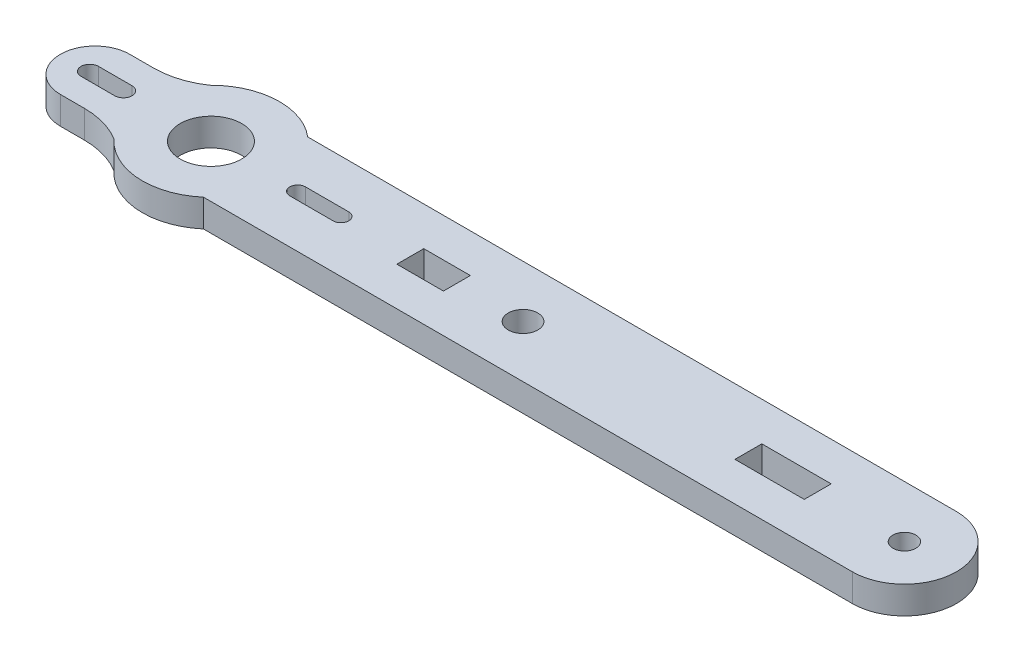
ISO-10303-21;
HEADER;
FILE_DESCRIPTION(('STEP AP214'),'2;1');
FILE_NAME('part.step','',(''),(''),'','','');
FILE_SCHEMA(('AUTOMOTIVE_DESIGN { 1 0 10303 214 1 1 1 1 }'));
ENDSEC;
DATA;
#1=APPLICATION_CONTEXT('core data for automotive mechanical design processes');
#2=APPLICATION_PROTOCOL_DEFINITION('international standard','automotive_design',2000,#1);
#3=PRODUCT_CONTEXT('',#1,'mechanical');
#4=PRODUCT('Part','Part','',(#3));
#5=PRODUCT_RELATED_PRODUCT_CATEGORY('part','',(#4));
#6=PRODUCT_DEFINITION_FORMATION('','',#4);
#7=PRODUCT_DEFINITION_CONTEXT('part definition',#1,'design');
#8=PRODUCT_DEFINITION('design','',#6,#7);
#9=PRODUCT_DEFINITION_SHAPE('','',#8);
#10=(LENGTH_UNIT() NAMED_UNIT(*) SI_UNIT(.MILLI.,.METRE.));
#11=(NAMED_UNIT(*) PLANE_ANGLE_UNIT() SI_UNIT($,.RADIAN.));
#12=(NAMED_UNIT(*) SI_UNIT($,.STERADIAN.) SOLID_ANGLE_UNIT());
#13=UNCERTAINTY_MEASURE_WITH_UNIT(LENGTH_MEASURE(1.E-05),#10,'distance_accuracy_value','');
#14=(GEOMETRIC_REPRESENTATION_CONTEXT(3) GLOBAL_UNCERTAINTY_ASSIGNED_CONTEXT((#13)) GLOBAL_UNIT_ASSIGNED_CONTEXT((#10,
#11,#12)) REPRESENTATION_CONTEXT('',''));
#15=CARTESIAN_POINT('',(0.,0.,0.));
#16=DIRECTION('',(0.,0.,1.));
#17=DIRECTION('',(1.,0.,0.));
#18=AXIS2_PLACEMENT_3D('',#15,#16,#17);
#19=CARTESIAN_POINT('',(-46.1508881650413,3.175,12.73172366087));
#20=DIRECTION('',(0.,-1.,0.));
#21=DIRECTION('',(0.,0.,-1.));
#22=AXIS2_PLACEMENT_3D('',#19,#20,#21);
#23=PLANE('',#22);
#24=CARTESIAN_POINT('',(-20.5826645707768,3.175,-0.385085228693363));
#25=DIRECTION('',(0.,1.,0.));
#26=DIRECTION('',(0.,0.,-1.));
#27=AXIS2_PLACEMENT_3D('',#24,#25,#26);
#28=CIRCLE('',#27,0.899974349717586);
#29=CARTESIAN_POINT('',(-20.5826645707768,3.175,0.514889121024237));
#30=VERTEX_POINT('',#29);
#31=CARTESIAN_POINT('',(-20.5826645707768,3.175,-1.28505957841094));
#32=VERTEX_POINT('',#31);
#33=EDGE_CURVE('E244',#30,#32,#28,.T.);
#34=ORIENTED_EDGE('',*,*,#33,.F.);
#35=DIRECTION('',(1.,0.,0.));
#36=VECTOR('',#35,1.);
#37=CARTESIAN_POINT('',(-20.5826645707768,3.175,0.514889121024237));
#38=LINE('',#37,#36);
#39=CARTESIAN_POINT('',(-25.5738409854409,3.175,0.514889121024237));
#40=VERTEX_POINT('',#39);
#41=EDGE_CURVE('E252',#40,#30,#38,.T.);
#42=ORIENTED_EDGE('',*,*,#41,.F.);
#43=CARTESIAN_POINT('',(-25.5738409854409,3.175,-0.385085228693349));
#44=DIRECTION('',(0.,1.,0.));
#45=DIRECTION('',(0.,0.,1.));
#46=AXIS2_PLACEMENT_3D('',#43,#44,#45);
#47=CIRCLE('',#46,0.899974349717586);
#48=CARTESIAN_POINT('',(-25.5738409854409,3.175,-1.28505957841094));
#49=VERTEX_POINT('',#48);
#50=EDGE_CURVE('E249',#49,#40,#47,.T.);
#51=ORIENTED_EDGE('',*,*,#50,.F.);
#52=DIRECTION('',(-1.,0.,0.));
#53=VECTOR('',#52,1.);
#54=CARTESIAN_POINT('',(-25.5738409854409,3.175,-1.28505957841094));
#55=LINE('',#54,#53);
#56=EDGE_CURVE('E246',#32,#49,#55,.T.);
#57=ORIENTED_EDGE('',*,*,#56,.F.);
#58=EDGE_LOOP('',(#34,#42,#51,#57));
#59=FACE_BOUND('',#58,.T.);
#60=DIRECTION('',(-1.,0.,0.));
#61=VECTOR('',#60,1.);
#62=CARTESIAN_POINT('',(34.3200127772081,3.175,-1.93514359702635));
#63=LINE('',#62,#61);
#64=CARTESIAN_POINT('',(34.3200127772081,3.175,-1.93514359702635));
#65=VERTEX_POINT('',#64);
#66=CARTESIAN_POINT('',(26.3341227148356,3.175,-1.93514359702635));
#67=VERTEX_POINT('',#66);
#68=EDGE_CURVE('E308',#65,#67,#63,.T.);
#69=ORIENTED_EDGE('',*,*,#68,.F.);
#70=DIRECTION('',(0.,0.,-1.));
#71=VECTOR('',#70,1.);
#72=CARTESIAN_POINT('',(34.3200127772081,3.175,1.1148524905702));
#73=LINE('',#72,#71);
#74=CARTESIAN_POINT('',(34.3200127772081,3.175,1.16497314430927));
#75=VERTEX_POINT('',#74);
#76=EDGE_CURVE('E306',#75,#65,#73,.T.);
#77=ORIENTED_EDGE('',*,*,#76,.F.);
#78=DIRECTION('',(1.,0.,0.));
#79=VECTOR('',#78,1.);
#80=CARTESIAN_POINT('',(26.3341227148356,3.175,1.16497314430927));
#81=LINE('',#80,#79);
#82=CARTESIAN_POINT('',(26.3341227148356,3.175,1.16497314430927));
#83=VERTEX_POINT('',#82);
#84=EDGE_CURVE('E313',#83,#75,#81,.T.);
#85=ORIENTED_EDGE('',*,*,#84,.F.);
#86=DIRECTION('',(0.,0.,1.));
#87=VECTOR('',#86,1.);
#88=CARTESIAN_POINT('',(26.3341227148356,3.175,-1.93514359702635));
#89=LINE('',#88,#87);
#90=EDGE_CURVE('E311',#67,#83,#89,.T.);
#91=ORIENTED_EDGE('',*,*,#90,.F.);
#92=EDGE_LOOP('',(#69,#77,#85,#91));
#93=FACE_BOUND('',#92,.T.);
#94=CARTESIAN_POINT('',(-46.1508881650413,3.175,12.73172366087));
#95=DIRECTION('',(0.,-1.,0.));
#96=DIRECTION('',(0.,0.,-1.));
#97=AXIS2_PLACEMENT_3D('',#94,#95,#96);
#98=CIRCLE('',#97,9.12131960573424);
#99=CARTESIAN_POINT('',(-46.1508881650413,3.175,3.61040405513577));
#100=VERTEX_POINT('',#99);
#101=CARTESIAN_POINT('',(-41.3809650965985,3.175,4.95700146190436));
#102=VERTEX_POINT('',#101);
#103=EDGE_CURVE('E355',#100,#102,#98,.T.);
#104=ORIENTED_EDGE('',*,*,#103,.T.);
#105=CARTESIAN_POINT('',(-35.5598693133355,3.175,-0.389755399260115));
#106=DIRECTION('',(0.,1.,0.));
#107=DIRECTION('',(0.,0.,1.));
#108=AXIS2_PLACEMENT_3D('',#105,#106,#107);
#109=CIRCLE('',#108,7.90398412513158);
#110=CARTESIAN_POINT('',(-30.4203086036687,3.175,5.61506606036555));
#111=VERTEX_POINT('',#110);
#112=EDGE_CURVE('E358',#102,#111,#109,.T.);
#113=ORIENTED_EDGE('',*,*,#112,.T.);
#114=DIRECTION('',(1.,0.,0.));
#115=VECTOR('',#114,1.);
#116=CARTESIAN_POINT('',(-30.4203086036687,3.175,5.61506606036555));
#117=LINE('',#116,#115);
#118=CARTESIAN_POINT('',(44.3021859087163,3.175,5.61506606036555));
#119=VERTEX_POINT('',#118);
#120=EDGE_CURVE('E361',#111,#119,#117,.T.);
#121=ORIENTED_EDGE('',*,*,#120,.T.);
#122=CARTESIAN_POINT('',(44.3021859087163,3.175,-0.387483181452966));
#123=DIRECTION('',(0.,1.,0.));
#124=DIRECTION('',(0.,0.,1.));
#125=AXIS2_PLACEMENT_3D('',#122,#123,#124);
#126=CIRCLE('',#125,6.00254924181851);
#127=CARTESIAN_POINT('',(44.3021859087163,3.175,-6.39003242327148));
#128=VERTEX_POINT('',#127);
#129=EDGE_CURVE('E363',#119,#128,#126,.T.);
#130=ORIENTED_EDGE('',*,*,#129,.T.);
#131=DIRECTION('',(-0.999999998208426,0.,-5.98593977840494E-05));
#132=VECTOR('',#131,1.);
#133=CARTESIAN_POINT('',(-30.420224954168,3.175,-6.39450526179472));
#134=LINE('',#133,#132);
#135=CARTESIAN_POINT('',(-30.420224954168,3.175,-6.39450526179472));
#136=VERTEX_POINT('',#135);
#137=EDGE_CURVE('E365',#128,#136,#134,.T.);
#138=ORIENTED_EDGE('',*,*,#137,.T.);
#139=CARTESIAN_POINT('',(-35.5598693133355,3.175,-0.389755399260115));
#140=DIRECTION('',(0.,1.,0.));
#141=DIRECTION('',(0.,0.,1.));
#142=AXIS2_PLACEMENT_3D('',#139,#140,#141);
#143=CIRCLE('',#142,7.90398412513158);
#144=CARTESIAN_POINT('',(-41.2087863988386,3.175,-5.91810965811905));
#145=VERTEX_POINT('',#144);
#146=EDGE_CURVE('E367',#136,#145,#143,.T.);
#147=ORIENTED_EDGE('',*,*,#146,.T.);
#148=CARTESIAN_POINT('',(-46.1508881650413,3.175,-13.1454849063283));
#149=DIRECTION('',(0.,-1.,0.));
#150=DIRECTION('',(0.,0.,1.));
#151=AXIS2_PLACEMENT_3D('',#148,#149,#150);
#152=CIRCLE('',#151,8.75553098595006);
#153=CARTESIAN_POINT('',(-46.1508881650413,3.175,-4.38995392037821));
#154=VERTEX_POINT('',#153);
#155=EDGE_CURVE('E369',#145,#154,#152,.T.);
#156=ORIENTED_EDGE('',*,*,#155,.T.);
#157=DIRECTION('',(-1.,0.,0.));
#158=VECTOR('',#157,1.);
#159=CARTESIAN_POINT('',(-46.1508881650413,3.175,-4.38995392037821));
#160=LINE('',#159,#158);
#161=CARTESIAN_POINT('',(-48.9096652526682,3.175,-4.38995392037821));
#162=VERTEX_POINT('',#161);
#163=EDGE_CURVE('E371',#154,#162,#160,.T.);
#164=ORIENTED_EDGE('',*,*,#163,.T.);
#165=CARTESIAN_POINT('',(-48.9096652526682,3.175,-0.389774932621221));
#166=DIRECTION('',(0.,1.,0.));
#167=DIRECTION('',(0.,0.,1.));
#168=AXIS2_PLACEMENT_3D('',#165,#166,#167);
#169=CIRCLE('',#168,4.00017898775699);
#170=CARTESIAN_POINT('',(-48.9096652526682,3.175,3.61040405513577));
#171=VERTEX_POINT('',#170);
#172=EDGE_CURVE('E373',#162,#171,#169,.T.);
#173=ORIENTED_EDGE('',*,*,#172,.T.);
#174=DIRECTION('',(1.,0.,0.));
#175=VECTOR('',#174,1.);
#176=CARTESIAN_POINT('',(-48.9096652526682,3.175,3.61040405513577));
#177=LINE('',#176,#175);
#178=EDGE_CURVE('E375',#171,#100,#177,.T.);
#179=ORIENTED_EDGE('',*,*,#178,.T.);
#180=EDGE_LOOP('',(#104,#113,#121,#130,#138,#147,#156,#164,#173,#179));
#181=FACE_BOUND('',#180,.T.);
#182=CARTESIAN_POINT('',(44.3021859087163,3.175,-0.387483181452966));
#183=DIRECTION('',(0.,1.,0.));
#184=DIRECTION('',(0.,0.,1.));
#185=AXIS2_PLACEMENT_3D('',#182,#183,#184);
#186=CIRCLE('',#185,1.32262221921054);
#187=CARTESIAN_POINT('',(44.3021859087163,3.175,0.93513903775757));
#188=VERTEX_POINT('',#187);
#189=EDGE_CURVE('E349',#188,#188,#186,.T.);
#190=ORIENTED_EDGE('',*,*,#189,.F.);
#191=EDGE_LOOP('',(#190));
#192=FACE_BOUND('',#191,.T.);
#193=CARTESIAN_POINT('',(0.383109325227615,3.175,-0.385153591561826));
#194=DIRECTION('',(0.,1.,0.));
#195=DIRECTION('',(0.,0.,1.));
#196=AXIS2_PLACEMENT_3D('',#193,#194,#195);
#197=CIRCLE('',#196,1.7);
#198=CARTESIAN_POINT('',(0.383109325227615,3.175,1.31484640843817));
#199=VERTEX_POINT('',#198);
#200=EDGE_CURVE('E343',#199,#199,#197,.T.);
#201=ORIENTED_EDGE('',*,*,#200,.F.);
#202=EDGE_LOOP('',(#201));
#203=FACE_BOUND('',#202,.T.);
#204=CARTESIAN_POINT('',(-35.5598693133355,3.175,-0.389755399260115));
#205=DIRECTION('',(0.,1.,0.));
#206=DIRECTION('',(0.,0.,1.));
#207=AXIS2_PLACEMENT_3D('',#204,#205,#206);
#208=CIRCLE('',#207,3.54358151821535);
#209=CARTESIAN_POINT('',(-35.5598693133355,3.175,3.15382611895524));
#210=VERTEX_POINT('',#209);
#211=EDGE_CURVE('E337',#210,#210,#208,.T.);
#212=ORIENTED_EDGE('',*,*,#211,.F.);
#213=EDGE_LOOP('',(#212));
#214=FACE_BOUND('',#213,.T.);
#215=DIRECTION('',(0.,0.,-1.));
#216=VECTOR('',#215,1.);
#217=CARTESIAN_POINT('',(-7.23312209646554,3.175,1.16477781654983));
#218=LINE('',#217,#216);
#219=CARTESIAN_POINT('',(-7.23312209646554,3.175,1.16477781654983));
#220=VERTEX_POINT('',#219);
#221=CARTESIAN_POINT('',(-7.23312209646554,3.175,-1.93494827276897));
#222=VERTEX_POINT('',#221);
#223=EDGE_CURVE('E275',#220,#222,#218,.T.);
#224=ORIENTED_EDGE('',*,*,#223,.F.);
#225=DIRECTION('',(1.,0.,0.));
#226=VECTOR('',#225,1.);
#227=CARTESIAN_POINT('',(-12.5967647598336,3.175,1.16477781654983));
#228=LINE('',#227,#226);
#229=CARTESIAN_POINT('',(-12.5967647598336,3.175,1.16477781654983));
#230=VERTEX_POINT('',#229);
#231=EDGE_CURVE('E283',#230,#220,#228,.T.);
#232=ORIENTED_EDGE('',*,*,#231,.F.);
#233=DIRECTION('',(0.,0.,1.));
#234=VECTOR('',#233,1.);
#235=CARTESIAN_POINT('',(-12.5967647598336,3.175,-1.93494827276897));
#236=LINE('',#235,#234);
#237=CARTESIAN_POINT('',(-12.5967647598336,3.175,-1.93494827276897));
#238=VERTEX_POINT('',#237);
#239=EDGE_CURVE('E280',#238,#230,#236,.T.);
#240=ORIENTED_EDGE('',*,*,#239,.F.);
#241=DIRECTION('',(-1.,0.,0.));
#242=VECTOR('',#241,1.);
#243=CARTESIAN_POINT('',(-7.23312209646554,3.175,-1.93494827276897));
#244=LINE('',#243,#242);
#245=EDGE_CURVE('E277',#222,#238,#244,.T.);
#246=ORIENTED_EDGE('',*,*,#245,.F.);
#247=EDGE_LOOP('',(#224,#232,#240,#246));
#248=FACE_BOUND('',#247,.T.);
#249=CARTESIAN_POINT('',(-49.5122186161084,3.175,-0.385182892774616));
#250=DIRECTION('',(0.,1.,0.));
#251=DIRECTION('',(0.,0.,1.));
#252=AXIS2_PLACEMENT_3D('',#249,#250,#251);
#253=CIRCLE('',#252,1.00003986378883);
#254=CARTESIAN_POINT('',(-49.5122186161084,3.175,-1.38522275656344));
#255=VERTEX_POINT('',#254);
#256=CARTESIAN_POINT('',(-49.5122186161084,3.175,0.61485697101421));
#257=VERTEX_POINT('',#256);
#258=EDGE_CURVE('E208',#255,#257,#253,.T.);
#259=ORIENTED_EDGE('',*,*,#258,.F.);
#260=DIRECTION('',(-1.,0.,0.));
#261=VECTOR('',#260,1.);
#262=CARTESIAN_POINT('',(-49.5122186161084,3.175,-1.38522275656344));
#263=LINE('',#262,#261);
#264=CARTESIAN_POINT('',(-45.6380802478693,3.175,-1.38522275656344));
#265=VERTEX_POINT('',#264);
#266=EDGE_CURVE('E230',#265,#255,#263,.T.);
#267=ORIENTED_EDGE('',*,*,#266,.F.);
#268=CARTESIAN_POINT('',(-45.6380802478693,3.175,-0.385182892774616));
#269=DIRECTION('',(0.,1.,0.));
#270=DIRECTION('',(0.,0.,-1.));
#271=AXIS2_PLACEMENT_3D('',#268,#269,#270);
#272=CIRCLE('',#271,1.00003986378883);
#273=CARTESIAN_POINT('',(-45.6380802478693,3.175,0.61485697101421));
#274=VERTEX_POINT('',#273);
#275=EDGE_CURVE('E228',#274,#265,#272,.T.);
#276=ORIENTED_EDGE('',*,*,#275,.F.);
#277=DIRECTION('',(1.,0.,0.));
#278=VECTOR('',#277,1.);
#279=CARTESIAN_POINT('',(-45.6380802478693,3.175,0.61485697101421));
#280=LINE('',#279,#278);
#281=EDGE_CURVE('E216',#257,#274,#280,.T.);
#282=ORIENTED_EDGE('',*,*,#281,.F.);
#283=EDGE_LOOP('',(#259,#267,#276,#282));
#284=FACE_BOUND('',#283,.T.);
#285=ADVANCED_FACE('F35',(#59,#93,#181,#192,#203,#214,#248,#284),#23,.F.);
#286=CARTESIAN_POINT('',(-46.1508881650413,0.,12.73172366087));
#287=DIRECTION('',(0.,-1.,0.));
#288=DIRECTION('',(0.,0.,-1.));
#289=AXIS2_PLACEMENT_3D('',#286,#287,#288);
#290=PLANE('',#289);
#291=CARTESIAN_POINT('',(0.383109325227615,0.,-0.385153591561826));
#292=DIRECTION('',(0.,1.,0.));
#293=DIRECTION('',(0.,0.,1.));
#294=AXIS2_PLACEMENT_3D('',#291,#292,#293);
#295=CIRCLE('',#294,1.7);
#296=CARTESIAN_POINT('',(0.383109325227615,0.,1.31484640843817));
#297=VERTEX_POINT('',#296);
#298=EDGE_CURVE('E340',#297,#297,#295,.T.);
#299=ORIENTED_EDGE('',*,*,#298,.T.);
#300=EDGE_LOOP('',(#299));
#301=FACE_BOUND('',#300,.T.);
#302=CARTESIAN_POINT('',(-46.1508881650413,0.,12.73172366087));
#303=DIRECTION('',(0.,-1.,0.));
#304=DIRECTION('',(0.,0.,-1.));
#305=AXIS2_PLACEMENT_3D('',#302,#303,#304);
#306=CIRCLE('',#305,9.12131960573424);
#307=CARTESIAN_POINT('',(-46.1508881650413,0.,3.61040405513577));
#308=VERTEX_POINT('',#307);
#309=CARTESIAN_POINT('',(-41.3809650965985,0.,4.95700146190436));
#310=VERTEX_POINT('',#309);
#311=EDGE_CURVE('E352',#308,#310,#306,.T.);
#312=ORIENTED_EDGE('',*,*,#311,.F.);
#313=DIRECTION('',(1.,0.,0.));
#314=VECTOR('',#313,1.);
#315=CARTESIAN_POINT('',(-48.9096652526682,0.,3.61040405513577));
#316=LINE('',#315,#314);
#317=CARTESIAN_POINT('',(-48.9096652526682,0.,3.61040405513577));
#318=VERTEX_POINT('',#317);
#319=EDGE_CURVE('E359',#318,#308,#316,.T.);
#320=ORIENTED_EDGE('',*,*,#319,.F.);
#321=CARTESIAN_POINT('',(-48.9096652526682,0.,-0.389774932621221));
#322=DIRECTION('',(0.,1.,0.));
#323=DIRECTION('',(0.,0.,1.));
#324=AXIS2_PLACEMENT_3D('',#321,#322,#323);
#325=CIRCLE('',#324,4.00017898775699);
#326=CARTESIAN_POINT('',(-48.9096652526682,0.,-4.38995392037821));
#327=VERTEX_POINT('',#326);
#328=EDGE_CURVE('E394',#327,#318,#325,.T.);
#329=ORIENTED_EDGE('',*,*,#328,.F.);
#330=DIRECTION('',(-1.,0.,0.));
#331=VECTOR('',#330,1.);
#332=CARTESIAN_POINT('',(-46.1508881650413,0.,-4.38995392037821));
#333=LINE('',#332,#331);
#334=CARTESIAN_POINT('',(-46.1508881650413,0.,-4.38995392037821));
#335=VERTEX_POINT('',#334);
#336=EDGE_CURVE('E392',#335,#327,#333,.T.);
#337=ORIENTED_EDGE('',*,*,#336,.F.);
#338=CARTESIAN_POINT('',(-46.1508881650413,0.,-13.1454849063283));
#339=DIRECTION('',(0.,-1.,0.));
#340=DIRECTION('',(0.,0.,1.));
#341=AXIS2_PLACEMENT_3D('',#338,#339,#340);
#342=CIRCLE('',#341,8.75553098595006);
#343=CARTESIAN_POINT('',(-41.2087863988386,0.,-5.91810965811905));
#344=VERTEX_POINT('',#343);
#345=EDGE_CURVE('E390',#344,#335,#342,.T.);
#346=ORIENTED_EDGE('',*,*,#345,.F.);
#347=CARTESIAN_POINT('',(-35.5598693133355,0.,-0.389755399260115));
#348=DIRECTION('',(0.,1.,0.));
#349=DIRECTION('',(0.,0.,1.));
#350=AXIS2_PLACEMENT_3D('',#347,#348,#349);
#351=CIRCLE('',#350,7.90398412513158);
#352=CARTESIAN_POINT('',(-30.420224954168,0.,-6.39450526179472));
#353=VERTEX_POINT('',#352);
#354=EDGE_CURVE('E388',#353,#344,#351,.T.);
#355=ORIENTED_EDGE('',*,*,#354,.F.);
#356=DIRECTION('',(-0.999999998208426,0.,-5.98593977840494E-05));
#357=VECTOR('',#356,1.);
#358=CARTESIAN_POINT('',(-30.420224954168,0.,-6.39450526179472));
#359=LINE('',#358,#357);
#360=CARTESIAN_POINT('',(44.3021859087163,0.,-6.39003242327148));
#361=VERTEX_POINT('',#360);
#362=EDGE_CURVE('E386',#361,#353,#359,.T.);
#363=ORIENTED_EDGE('',*,*,#362,.F.);
#364=CARTESIAN_POINT('',(44.3021859087163,0.,-0.387483181452966));
#365=DIRECTION('',(0.,1.,0.));
#366=DIRECTION('',(0.,0.,1.));
#367=AXIS2_PLACEMENT_3D('',#364,#365,#366);
#368=CIRCLE('',#367,6.00254924181851);
#369=CARTESIAN_POINT('',(44.3021859087163,0.,5.61506606036555));
#370=VERTEX_POINT('',#369);
#371=EDGE_CURVE('E384',#370,#361,#368,.T.);
#372=ORIENTED_EDGE('',*,*,#371,.F.);
#373=DIRECTION('',(1.,0.,0.));
#374=VECTOR('',#373,1.);
#375=CARTESIAN_POINT('',(-30.4203086036687,0.,5.61506606036555));
#376=LINE('',#375,#374);
#377=CARTESIAN_POINT('',(-30.4203086036687,0.,5.61506606036555));
#378=VERTEX_POINT('',#377);
#379=EDGE_CURVE('E382',#378,#370,#376,.T.);
#380=ORIENTED_EDGE('',*,*,#379,.F.);
#381=CARTESIAN_POINT('',(-35.5598693133355,0.,-0.389755399260115));
#382=DIRECTION('',(0.,1.,0.));
#383=DIRECTION('',(0.,0.,1.));
#384=AXIS2_PLACEMENT_3D('',#381,#382,#383);
#385=CIRCLE('',#384,7.90398412513158);
#386=EDGE_CURVE('E380',#310,#378,#385,.T.);
#387=ORIENTED_EDGE('',*,*,#386,.F.);
#388=EDGE_LOOP('',(#312,#320,#329,#337,#346,#355,#363,#372,#380,#387));
#389=FACE_BOUND('',#388,.T.);
#390=CARTESIAN_POINT('',(44.3021859087163,0.,-0.387483181452966));
#391=DIRECTION('',(0.,1.,0.));
#392=DIRECTION('',(0.,0.,1.));
#393=AXIS2_PLACEMENT_3D('',#390,#391,#392);
#394=CIRCLE('',#393,1.32262221921054);
#395=CARTESIAN_POINT('',(44.3021859087163,0.,0.93513903775757));
#396=VERTEX_POINT('',#395);
#397=EDGE_CURVE('E346',#396,#396,#394,.T.);
#398=ORIENTED_EDGE('',*,*,#397,.T.);
#399=EDGE_LOOP('',(#398));
#400=FACE_BOUND('',#399,.T.);
#401=CARTESIAN_POINT('',(-35.5598693133355,0.,-0.389755399260115));
#402=DIRECTION('',(0.,1.,0.));
#403=DIRECTION('',(0.,0.,1.));
#404=AXIS2_PLACEMENT_3D('',#401,#402,#403);
#405=CIRCLE('',#404,3.54358151821535);
#406=CARTESIAN_POINT('',(-35.5598693133355,0.,3.15382611895524));
#407=VERTEX_POINT('',#406);
#408=EDGE_CURVE('E336',#407,#407,#405,.T.);
#409=ORIENTED_EDGE('',*,*,#408,.T.);
#410=EDGE_LOOP('',(#409));
#411=FACE_BOUND('',#410,.T.);
#412=DIRECTION('',(0.,0.,-1.));
#413=VECTOR('',#412,1.);
#414=CARTESIAN_POINT('',(34.3200127772081,0.,1.16497314430927));
#415=LINE('',#414,#413);
#416=CARTESIAN_POINT('',(34.3200127772081,0.,1.16497314430927));
#417=VERTEX_POINT('',#416);
#418=CARTESIAN_POINT('',(34.3200127772081,0.,-1.93514359702635));
#419=VERTEX_POINT('',#418);
#420=EDGE_CURVE('E309',#417,#419,#415,.T.);
#421=ORIENTED_EDGE('',*,*,#420,.T.);
#422=DIRECTION('',(-1.,0.,0.));
#423=VECTOR('',#422,1.);
#424=CARTESIAN_POINT('',(34.3200127772081,0.,-1.93514359702635));
#425=LINE('',#424,#423);
#426=CARTESIAN_POINT('',(26.3341227148356,0.,-1.93514359702635));
#427=VERTEX_POINT('',#426);
#428=EDGE_CURVE('E305',#419,#427,#425,.T.);
#429=ORIENTED_EDGE('',*,*,#428,.T.);
#430=DIRECTION('',(0.,0.,1.));
#431=VECTOR('',#430,1.);
#432=CARTESIAN_POINT('',(26.3341227148356,0.,1.11485249056983));
#433=LINE('',#432,#431);
#434=CARTESIAN_POINT('',(26.3341227148356,0.,1.16497314430927));
#435=VERTEX_POINT('',#434);
#436=EDGE_CURVE('E319',#427,#435,#433,.T.);
#437=ORIENTED_EDGE('',*,*,#436,.T.);
#438=DIRECTION('',(1.,0.,0.));
#439=VECTOR('',#438,1.);
#440=CARTESIAN_POINT('',(26.3341227148356,0.,1.16497314430927));
#441=LINE('',#440,#439);
#442=EDGE_CURVE('E322',#435,#417,#441,.T.);
#443=ORIENTED_EDGE('',*,*,#442,.T.);
#444=EDGE_LOOP('',(#421,#429,#437,#443));
#445=FACE_BOUND('',#444,.T.);
#446=DIRECTION('',(1.,0.,0.));
#447=VECTOR('',#446,1.);
#448=CARTESIAN_POINT('',(-12.5967647598336,0.,1.16477781654983));
#449=LINE('',#448,#447);
#450=CARTESIAN_POINT('',(-12.5967647598336,0.,1.16477781654983));
#451=VERTEX_POINT('',#450);
#452=CARTESIAN_POINT('',(-7.23312209646554,0.,1.16477781654983));
#453=VERTEX_POINT('',#452);
#454=EDGE_CURVE('E278',#451,#453,#449,.T.);
#455=ORIENTED_EDGE('',*,*,#454,.T.);
#456=DIRECTION('',(0.,0.,-1.));
#457=VECTOR('',#456,1.);
#458=CARTESIAN_POINT('',(-7.23312209646554,0.,1.16477781654983));
#459=LINE('',#458,#457);
#460=CARTESIAN_POINT('',(-7.23312209646554,0.,-1.93494827276897));
#461=VERTEX_POINT('',#460);
#462=EDGE_CURVE('E274',#453,#461,#459,.T.);
#463=ORIENTED_EDGE('',*,*,#462,.T.);
#464=DIRECTION('',(-1.,0.,0.));
#465=VECTOR('',#464,1.);
#466=CARTESIAN_POINT('',(-7.23312209646554,0.,-1.93494827276897));
#467=LINE('',#466,#465);
#468=CARTESIAN_POINT('',(-12.5967647598336,0.,-1.93494827276897));
#469=VERTEX_POINT('',#468);
#470=EDGE_CURVE('E288',#461,#469,#467,.T.);
#471=ORIENTED_EDGE('',*,*,#470,.T.);
#472=DIRECTION('',(0.,0.,1.));
#473=VECTOR('',#472,1.);
#474=CARTESIAN_POINT('',(-12.5967647598336,0.,-1.93494827276897));
#475=LINE('',#474,#473);
#476=EDGE_CURVE('E291',#469,#451,#475,.T.);
#477=ORIENTED_EDGE('',*,*,#476,.T.);
#478=EDGE_LOOP('',(#455,#463,#471,#477));
#479=FACE_BOUND('',#478,.T.);
#480=DIRECTION('',(1.,0.,0.));
#481=VECTOR('',#480,1.);
#482=CARTESIAN_POINT('',(-20.5826645707768,0.,0.514889121024237));
#483=LINE('',#482,#481);
#484=CARTESIAN_POINT('',(-25.5738409854409,0.,0.514889121024237));
#485=VERTEX_POINT('',#484);
#486=CARTESIAN_POINT('',(-20.5826645707768,0.,0.514889121024237));
#487=VERTEX_POINT('',#486);
#488=EDGE_CURVE('E247',#485,#487,#483,.T.);
#489=ORIENTED_EDGE('',*,*,#488,.T.);
#490=CARTESIAN_POINT('',(-20.5826645707768,0.,-0.385085228693363));
#491=DIRECTION('',(0.,1.,0.));
#492=DIRECTION('',(0.,0.,-1.));
#493=AXIS2_PLACEMENT_3D('',#490,#491,#492);
#494=CIRCLE('',#493,0.899974349717586);
#495=CARTESIAN_POINT('',(-20.5826645707768,0.,-1.28505957841094));
#496=VERTEX_POINT('',#495);
#497=EDGE_CURVE('E224',#487,#496,#494,.T.);
#498=ORIENTED_EDGE('',*,*,#497,.T.);
#499=DIRECTION('',(-1.,0.,0.));
#500=VECTOR('',#499,1.);
#501=CARTESIAN_POINT('',(-25.5738409854409,0.,-1.28505957841094));
#502=LINE('',#501,#500);
#503=CARTESIAN_POINT('',(-25.5738409854409,0.,-1.28505957841094));
#504=VERTEX_POINT('',#503);
#505=EDGE_CURVE('E257',#496,#504,#502,.T.);
#506=ORIENTED_EDGE('',*,*,#505,.T.);
#507=CARTESIAN_POINT('',(-25.5738409854409,0.,-0.385085228693349));
#508=DIRECTION('',(0.,1.,0.));
#509=DIRECTION('',(0.,0.,1.));
#510=AXIS2_PLACEMENT_3D('',#507,#508,#509);
#511=CIRCLE('',#510,0.899974349717586);
#512=EDGE_CURVE('E260',#504,#485,#511,.T.);
#513=ORIENTED_EDGE('',*,*,#512,.T.);
#514=EDGE_LOOP('',(#489,#498,#506,#513));
#515=FACE_BOUND('',#514,.T.);
#516=DIRECTION('',(-1.,0.,0.));
#517=VECTOR('',#516,1.);
#518=CARTESIAN_POINT('',(-49.5122186161084,0.,-1.38522275656344));
#519=LINE('',#518,#517);
#520=CARTESIAN_POINT('',(-45.6380802478693,0.,-1.38522275656344));
#521=VERTEX_POINT('',#520);
#522=CARTESIAN_POINT('',(-49.5122186161084,0.,-1.38522275656344));
#523=VERTEX_POINT('',#522);
#524=EDGE_CURVE('E217',#521,#523,#519,.T.);
#525=ORIENTED_EDGE('',*,*,#524,.T.);
#526=CARTESIAN_POINT('',(-49.5122186161084,0.,-0.385182892774616));
#527=DIRECTION('',(0.,1.,0.));
#528=DIRECTION('',(0.,0.,1.));
#529=AXIS2_PLACEMENT_3D('',#526,#527,#528);
#530=CIRCLE('',#529,1.00003986378883);
#531=CARTESIAN_POINT('',(-49.5122186161084,0.,0.61485697101421));
#532=VERTEX_POINT('',#531);
#533=EDGE_CURVE('E58',#523,#532,#530,.T.);
#534=ORIENTED_EDGE('',*,*,#533,.T.);
#535=DIRECTION('',(1.,0.,0.));
#536=VECTOR('',#535,1.);
#537=CARTESIAN_POINT('',(-45.6380802478693,0.,0.61485697101421));
#538=LINE('',#537,#536);
#539=CARTESIAN_POINT('',(-45.6380802478693,0.,0.61485697101421));
#540=VERTEX_POINT('',#539);
#541=EDGE_CURVE('E223',#532,#540,#538,.T.);
#542=ORIENTED_EDGE('',*,*,#541,.T.);
#543=CARTESIAN_POINT('',(-45.6380802478693,0.,-0.385182892774616));
#544=DIRECTION('',(0.,1.,0.));
#545=DIRECTION('',(0.,0.,-1.));
#546=AXIS2_PLACEMENT_3D('',#543,#544,#545);
#547=CIRCLE('',#546,1.00003986378883);
#548=EDGE_CURVE('E236',#540,#521,#547,.T.);
#549=ORIENTED_EDGE('',*,*,#548,.T.);
#550=EDGE_LOOP('',(#525,#534,#542,#549));
#551=FACE_BOUND('',#550,.T.);
#552=ADVANCED_FACE('F430',(#301,#389,#400,#411,#445,#479,#515,#551),#290,.T.);
#553=CARTESIAN_POINT('',(-46.1508881650413,3.175,12.73172366087));
#554=DIRECTION('',(0.,-1.,0.));
#555=DIRECTION('',(0.,0.,-1.));
#556=AXIS2_PLACEMENT_3D('',#553,#554,#555);
#557=CYLINDRICAL_SURFACE('',#556,9.12131960573424);
#558=ORIENTED_EDGE('',*,*,#311,.T.);
#559=DIRECTION('',(0.,-1.,0.));
#560=VECTOR('',#559,1.);
#561=CARTESIAN_POINT('',(-41.3809650965985,3.175,4.95700146190436));
#562=LINE('',#561,#560);
#563=EDGE_CURVE('E11',#102,#310,#562,.T.);
#564=ORIENTED_EDGE('',*,*,#563,.F.);
#565=ORIENTED_EDGE('',*,*,#103,.F.);
#566=DIRECTION('',(0.,-1.,0.));
#567=VECTOR('',#566,1.);
#568=CARTESIAN_POINT('',(-46.1508881650413,3.175,3.61040405513577));
#569=LINE('',#568,#567);
#570=EDGE_CURVE('E377',#100,#308,#569,.T.);
#571=ORIENTED_EDGE('',*,*,#570,.T.);
#572=EDGE_LOOP('',(#558,#564,#565,#571));
#573=FACE_BOUND('',#572,.T.);
#574=ADVANCED_FACE('F37',(#573),#557,.F.);
#575=CARTESIAN_POINT('',(-35.5598693133355,3.175,-0.389755399260115));
#576=DIRECTION('',(0.,-1.,0.));
#577=DIRECTION('',(0.,0.,-1.));
#578=AXIS2_PLACEMENT_3D('',#575,#576,#577);
#579=CYLINDRICAL_SURFACE('',#578,7.90398412513158);
#580=ORIENTED_EDGE('',*,*,#386,.T.);
#581=DIRECTION('',(0.,-1.,0.));
#582=VECTOR('',#581,1.);
#583=CARTESIAN_POINT('',(-30.4203086036687,3.175,5.61506606036555));
#584=LINE('',#583,#582);
#585=EDGE_CURVE('E43',#111,#378,#584,.T.);
#586=ORIENTED_EDGE('',*,*,#585,.F.);
#587=ORIENTED_EDGE('',*,*,#112,.F.);
#588=ORIENTED_EDGE('',*,*,#563,.T.);
#589=EDGE_LOOP('',(#580,#586,#587,#588));
#590=FACE_BOUND('',#589,.T.);
#591=ADVANCED_FACE('F448',(#590),#579,.T.);
#592=CARTESIAN_POINT('',(-30.4203086036687,3.175,5.61506606036555));
#593=DIRECTION('',(0.,0.,-1.));
#594=DIRECTION('',(-1.,0.,0.));
#595=AXIS2_PLACEMENT_3D('',#592,#593,#594);
#596=PLANE('',#595);
#597=ORIENTED_EDGE('',*,*,#379,.T.);
#598=DIRECTION('',(0.,-1.,0.));
#599=VECTOR('',#598,1.);
#600=CARTESIAN_POINT('',(44.3021859087163,3.175,5.61506606036555));
#601=LINE('',#600,#599);
#602=EDGE_CURVE('E417',#119,#370,#601,.T.);
#603=ORIENTED_EDGE('',*,*,#602,.F.);
#604=ORIENTED_EDGE('',*,*,#120,.F.);
#605=ORIENTED_EDGE('',*,*,#585,.T.);
#606=EDGE_LOOP('',(#597,#603,#604,#605));
#607=FACE_BOUND('',#606,.T.);
#608=ADVANCED_FACE('F424',(#607),#596,.F.);
#609=CARTESIAN_POINT('',(44.3021859087163,3.175,-0.387483181452966));
#610=DIRECTION('',(0.,-1.,0.));
#611=DIRECTION('',(0.,0.,-1.));
#612=AXIS2_PLACEMENT_3D('',#609,#610,#611);
#613=CYLINDRICAL_SURFACE('',#612,6.00254924181851);
#614=ORIENTED_EDGE('',*,*,#371,.T.);
#615=DIRECTION('',(0.,-1.,0.));
#616=VECTOR('',#615,1.);
#617=CARTESIAN_POINT('',(44.3021859087163,3.175,-6.39003242327148));
#618=LINE('',#617,#616);
#619=EDGE_CURVE('E414',#128,#361,#618,.T.);
#620=ORIENTED_EDGE('',*,*,#619,.F.);
#621=ORIENTED_EDGE('',*,*,#129,.F.);
#622=ORIENTED_EDGE('',*,*,#602,.T.);
#623=EDGE_LOOP('',(#614,#620,#621,#622));
#624=FACE_BOUND('',#623,.T.);
#625=ADVANCED_FACE('F436',(#624),#613,.T.);
#626=CARTESIAN_POINT('',(-30.420224954168,3.175,-6.39450526179472));
#627=DIRECTION('',(-5.98593977840493E-05,0.,0.999999998208426));
#628=DIRECTION('',(0.999999998208426,0.,5.98593977840494E-05));
#629=AXIS2_PLACEMENT_3D('',#626,#627,#628);
#630=PLANE('',#629);
#631=ORIENTED_EDGE('',*,*,#362,.T.);
#632=DIRECTION('',(0.,-1.,0.));
#633=VECTOR('',#632,1.);
#634=CARTESIAN_POINT('',(-30.420224954168,3.175,-6.39450526179472));
#635=LINE('',#634,#633);
#636=EDGE_CURVE('E411',#136,#353,#635,.T.);
#637=ORIENTED_EDGE('',*,*,#636,.F.);
#638=ORIENTED_EDGE('',*,*,#137,.F.);
#639=ORIENTED_EDGE('',*,*,#619,.T.);
#640=EDGE_LOOP('',(#631,#637,#638,#639));
#641=FACE_BOUND('',#640,.T.);
#642=ADVANCED_FACE('F440',(#641),#630,.F.);
#643=CARTESIAN_POINT('',(-35.5598693133355,3.175,-0.389755399260115));
#644=DIRECTION('',(0.,-1.,0.));
#645=DIRECTION('',(0.,0.,-1.));
#646=AXIS2_PLACEMENT_3D('',#643,#644,#645);
#647=CYLINDRICAL_SURFACE('',#646,7.90398412513158);
#648=ORIENTED_EDGE('',*,*,#354,.T.);
#649=DIRECTION('',(0.,-1.,0.));
#650=VECTOR('',#649,1.);
#651=CARTESIAN_POINT('',(-41.2087863988386,3.175,-5.91810965811905));
#652=LINE('',#651,#650);
#653=EDGE_CURVE('E408',#145,#344,#652,.T.);
#654=ORIENTED_EDGE('',*,*,#653,.F.);
#655=ORIENTED_EDGE('',*,*,#146,.F.);
#656=ORIENTED_EDGE('',*,*,#636,.T.);
#657=EDGE_LOOP('',(#648,#654,#655,#656));
#658=FACE_BOUND('',#657,.T.);
#659=ADVANCED_FACE('F471',(#658),#647,.T.);
#660=CARTESIAN_POINT('',(-46.1508881650413,3.175,-13.1454849063283));
#661=DIRECTION('',(0.,-1.,0.));
#662=DIRECTION('',(0.,0.,-1.));
#663=AXIS2_PLACEMENT_3D('',#660,#661,#662);
#664=CYLINDRICAL_SURFACE('',#663,8.75553098595006);
#665=ORIENTED_EDGE('',*,*,#345,.T.);
#666=DIRECTION('',(0.,-1.,0.));
#667=VECTOR('',#666,1.);
#668=CARTESIAN_POINT('',(-46.1508881650413,3.175,-4.38995392037821));
#669=LINE('',#668,#667);
#670=EDGE_CURVE('E405',#154,#335,#669,.T.);
#671=ORIENTED_EDGE('',*,*,#670,.F.);
#672=ORIENTED_EDGE('',*,*,#155,.F.);
#673=ORIENTED_EDGE('',*,*,#653,.T.);
#674=EDGE_LOOP('',(#665,#671,#672,#673));
#675=FACE_BOUND('',#674,.T.);
#676=ADVANCED_FACE('F468',(#675),#664,.F.);
#677=CARTESIAN_POINT('',(-46.1508881650413,3.175,-4.38995392037821));
#678=DIRECTION('',(0.,0.,1.));
#679=DIRECTION('',(1.,0.,0.));
#680=AXIS2_PLACEMENT_3D('',#677,#678,#679);
#681=PLANE('',#680);
#682=ORIENTED_EDGE('',*,*,#336,.T.);
#683=DIRECTION('',(0.,-1.,0.));
#684=VECTOR('',#683,1.);
#685=CARTESIAN_POINT('',(-48.9096652526682,3.175,-4.38995392037821));
#686=LINE('',#685,#684);
#687=EDGE_CURVE('E402',#162,#327,#686,.T.);
#688=ORIENTED_EDGE('',*,*,#687,.F.);
#689=ORIENTED_EDGE('',*,*,#163,.F.);
#690=ORIENTED_EDGE('',*,*,#670,.T.);
#691=EDGE_LOOP('',(#682,#688,#689,#690));
#692=FACE_BOUND('',#691,.T.);
#693=ADVANCED_FACE('F464',(#692),#681,.F.);
#694=CARTESIAN_POINT('',(-48.9096652526682,3.175,-0.389774932621221));
#695=DIRECTION('',(0.,-1.,0.));
#696=DIRECTION('',(0.,0.,-1.));
#697=AXIS2_PLACEMENT_3D('',#694,#695,#696);
#698=CYLINDRICAL_SURFACE('',#697,4.00017898775699);
#699=ORIENTED_EDGE('',*,*,#328,.T.);
#700=DIRECTION('',(0.,-1.,0.));
#701=VECTOR('',#700,1.);
#702=CARTESIAN_POINT('',(-48.9096652526682,3.175,3.61040405513577));
#703=LINE('',#702,#701);
#704=EDGE_CURVE('E399',#171,#318,#703,.T.);
#705=ORIENTED_EDGE('',*,*,#704,.F.);
#706=ORIENTED_EDGE('',*,*,#172,.F.);
#707=ORIENTED_EDGE('',*,*,#687,.T.);
#708=EDGE_LOOP('',(#699,#705,#706,#707));
#709=FACE_BOUND('',#708,.T.);
#710=ADVANCED_FACE('F460',(#709),#698,.T.);
#711=CARTESIAN_POINT('',(-48.9096652526682,3.175,3.61040405513577));
#712=DIRECTION('',(0.,0.,-1.));
#713=DIRECTION('',(-1.,0.,0.));
#714=AXIS2_PLACEMENT_3D('',#711,#712,#713);
#715=PLANE('',#714);
#716=ORIENTED_EDGE('',*,*,#319,.T.);
#717=ORIENTED_EDGE('',*,*,#570,.F.);
#718=ORIENTED_EDGE('',*,*,#178,.F.);
#719=ORIENTED_EDGE('',*,*,#704,.T.);
#720=EDGE_LOOP('',(#716,#717,#718,#719));
#721=FACE_BOUND('',#720,.T.);
#722=ADVANCED_FACE('F455',(#721),#715,.F.);
#723=CARTESIAN_POINT('',(44.3021859087163,3.175,-0.387483181452966));
#724=DIRECTION('',(0.,-1.,0.));
#725=DIRECTION('',(0.,0.,-1.));
#726=AXIS2_PLACEMENT_3D('',#723,#724,#725);
#727=CYLINDRICAL_SURFACE('',#726,1.32262221921054);
#728=ORIENTED_EDGE('',*,*,#189,.T.);
#729=EDGE_LOOP('',(#728));
#730=FACE_BOUND('',#729,.T.);
#731=ORIENTED_EDGE('',*,*,#397,.F.);
#732=EDGE_LOOP('',(#731));
#733=FACE_BOUND('',#732,.T.);
#734=ADVANCED_FACE('F491',(#730,#733),#727,.F.);
#735=CARTESIAN_POINT('',(0.383109325227615,3.175,-0.385153591561826));
#736=DIRECTION('',(0.,-1.,0.));
#737=DIRECTION('',(0.,0.,-1.));
#738=AXIS2_PLACEMENT_3D('',#735,#736,#737);
#739=CYLINDRICAL_SURFACE('',#738,1.7);
#740=ORIENTED_EDGE('',*,*,#200,.T.);
#741=EDGE_LOOP('',(#740));
#742=FACE_BOUND('',#741,.T.);
#743=ORIENTED_EDGE('',*,*,#298,.F.);
#744=EDGE_LOOP('',(#743));
#745=FACE_BOUND('',#744,.T.);
#746=ADVANCED_FACE('F517',(#742,#745),#739,.F.);
#747=CARTESIAN_POINT('',(-35.5598693133355,3.175,-0.389755399260115));
#748=DIRECTION('',(0.,-1.,0.));
#749=DIRECTION('',(0.,0.,-1.));
#750=AXIS2_PLACEMENT_3D('',#747,#748,#749);
#751=CYLINDRICAL_SURFACE('',#750,3.54358151821535);
#752=ORIENTED_EDGE('',*,*,#211,.T.);
#753=EDGE_LOOP('',(#752));
#754=FACE_BOUND('',#753,.T.);
#755=ORIENTED_EDGE('',*,*,#408,.F.);
#756=EDGE_LOOP('',(#755));
#757=FACE_BOUND('',#756,.T.);
#758=ADVANCED_FACE('F524',(#754,#757),#751,.F.);
#759=CARTESIAN_POINT('',(34.3200127772081,3.175,-1.93514359702635));
#760=DIRECTION('',(0.,0.,1.));
#761=DIRECTION('',(1.,0.,0.));
#762=AXIS2_PLACEMENT_3D('',#759,#760,#761);
#763=PLANE('',#762);
#764=ORIENTED_EDGE('',*,*,#428,.F.);
#765=DIRECTION('',(0.,-1.,0.));
#766=VECTOR('',#765,1.);
#767=CARTESIAN_POINT('',(34.3200127772081,3.175,-1.93514359702635));
#768=LINE('',#767,#766);
#769=EDGE_CURVE('E333',#65,#419,#768,.T.);
#770=ORIENTED_EDGE('',*,*,#769,.F.);
#771=ORIENTED_EDGE('',*,*,#68,.T.);
#772=DIRECTION('',(0.,-1.,0.));
#773=VECTOR('',#772,1.);
#774=CARTESIAN_POINT('',(26.3341227148356,3.175,-1.93514359702635));
#775=LINE('',#774,#773);
#776=EDGE_CURVE('E330',#67,#427,#775,.T.);
#777=ORIENTED_EDGE('',*,*,#776,.T.);
#778=EDGE_LOOP('',(#764,#770,#771,#777));
#779=FACE_BOUND('',#778,.T.);
#780=ADVANCED_FACE('F531',(#779),#763,.T.);
#781=CARTESIAN_POINT('',(26.3341227148356,3.175,1.11485249056983));
#782=DIRECTION('',(1.,0.,0.));
#783=DIRECTION('',(0.,0.,-1.));
#784=AXIS2_PLACEMENT_3D('',#781,#782,#783);
#785=PLANE('',#784);
#786=ORIENTED_EDGE('',*,*,#436,.F.);
#787=ORIENTED_EDGE('',*,*,#776,.F.);
#788=ORIENTED_EDGE('',*,*,#90,.T.);
#789=DIRECTION('',(0.,-1.,0.));
#790=VECTOR('',#789,1.);
#791=CARTESIAN_POINT('',(26.3341227148356,3.175,1.16497314430927));
#792=LINE('',#791,#790);
#793=EDGE_CURVE('E328',#83,#435,#792,.T.);
#794=ORIENTED_EDGE('',*,*,#793,.T.);
#795=EDGE_LOOP('',(#786,#787,#788,#794));
#796=FACE_BOUND('',#795,.T.);
#797=ADVANCED_FACE('F539',(#796),#785,.T.);
#798=CARTESIAN_POINT('',(26.3341227148356,3.175,1.16497314430927));
#799=DIRECTION('',(0.,0.,-1.));
#800=DIRECTION('',(-1.,0.,0.));
#801=AXIS2_PLACEMENT_3D('',#798,#799,#800);
#802=PLANE('',#801);
#803=ORIENTED_EDGE('',*,*,#442,.F.);
#804=ORIENTED_EDGE('',*,*,#793,.F.);
#805=ORIENTED_EDGE('',*,*,#84,.T.);
#806=DIRECTION('',(0.,-1.,0.));
#807=VECTOR('',#806,1.);
#808=CARTESIAN_POINT('',(34.3200127772081,3.175,1.16497314430927));
#809=LINE('',#808,#807);
#810=EDGE_CURVE('E316',#75,#417,#809,.T.);
#811=ORIENTED_EDGE('',*,*,#810,.T.);
#812=EDGE_LOOP('',(#803,#804,#805,#811));
#813=FACE_BOUND('',#812,.T.);
#814=ADVANCED_FACE('F547',(#813),#802,.T.);
#815=CARTESIAN_POINT('',(34.3200127772081,3.175,1.16497314430927));
#816=DIRECTION('',(-1.,0.,0.));
#817=DIRECTION('',(0.,0.,1.));
#818=AXIS2_PLACEMENT_3D('',#815,#816,#817);
#819=PLANE('',#818);
#820=ORIENTED_EDGE('',*,*,#420,.F.);
#821=ORIENTED_EDGE('',*,*,#810,.F.);
#822=ORIENTED_EDGE('',*,*,#76,.T.);
#823=ORIENTED_EDGE('',*,*,#769,.T.);
#824=EDGE_LOOP('',(#820,#821,#822,#823));
#825=FACE_BOUND('',#824,.T.);
#826=ADVANCED_FACE('F555',(#825),#819,.T.);
#827=CARTESIAN_POINT('',(-7.23312209646554,3.175,1.16477781654983));
#828=DIRECTION('',(-1.,0.,0.));
#829=DIRECTION('',(0.,0.,1.));
#830=AXIS2_PLACEMENT_3D('',#827,#828,#829);
#831=PLANE('',#830);
#832=ORIENTED_EDGE('',*,*,#462,.F.);
#833=DIRECTION('',(0.,-1.,0.));
#834=VECTOR('',#833,1.);
#835=CARTESIAN_POINT('',(-7.23312209646554,3.175,1.16477781654983));
#836=LINE('',#835,#834);
#837=EDGE_CURVE('E285',#220,#453,#836,.T.);
#838=ORIENTED_EDGE('',*,*,#837,.F.);
#839=ORIENTED_EDGE('',*,*,#223,.T.);
#840=DIRECTION('',(0.,-1.,0.));
#841=VECTOR('',#840,1.);
#842=CARTESIAN_POINT('',(-7.23312209646554,3.175,-1.93494827276897));
#843=LINE('',#842,#841);
#844=EDGE_CURVE('E302',#222,#461,#843,.T.);
#845=ORIENTED_EDGE('',*,*,#844,.T.);
#846=EDGE_LOOP('',(#832,#838,#839,#845));
#847=FACE_BOUND('',#846,.T.);
#848=ADVANCED_FACE('F563',(#847),#831,.T.);
#849=CARTESIAN_POINT('',(-7.23312209646554,3.175,-1.93494827276897));
#850=DIRECTION('',(0.,0.,1.));
#851=DIRECTION('',(1.,0.,0.));
#852=AXIS2_PLACEMENT_3D('',#849,#850,#851);
#853=PLANE('',#852);
#854=ORIENTED_EDGE('',*,*,#470,.F.);
#855=ORIENTED_EDGE('',*,*,#844,.F.);
#856=ORIENTED_EDGE('',*,*,#245,.T.);
#857=DIRECTION('',(0.,-1.,0.));
#858=VECTOR('',#857,1.);
#859=CARTESIAN_POINT('',(-12.5967647598336,3.175,-1.93494827276897));
#860=LINE('',#859,#858);
#861=EDGE_CURVE('E300',#238,#469,#860,.T.);
#862=ORIENTED_EDGE('',*,*,#861,.T.);
#863=EDGE_LOOP('',(#854,#855,#856,#862));
#864=FACE_BOUND('',#863,.T.);
#865=ADVANCED_FACE('F571',(#864),#853,.T.);
#866=CARTESIAN_POINT('',(-12.5967647598336,3.175,-1.93494827276897));
#867=DIRECTION('',(1.,0.,0.));
#868=DIRECTION('',(0.,0.,-1.));
#869=AXIS2_PLACEMENT_3D('',#866,#867,#868);
#870=PLANE('',#869);
#871=ORIENTED_EDGE('',*,*,#476,.F.);
#872=ORIENTED_EDGE('',*,*,#861,.F.);
#873=ORIENTED_EDGE('',*,*,#239,.T.);
#874=DIRECTION('',(0.,-1.,0.));
#875=VECTOR('',#874,1.);
#876=CARTESIAN_POINT('',(-12.5967647598336,3.175,1.16477781654983));
#877=LINE('',#876,#875);
#878=EDGE_CURVE('E298',#230,#451,#877,.T.);
#879=ORIENTED_EDGE('',*,*,#878,.T.);
#880=EDGE_LOOP('',(#871,#872,#873,#879));
#881=FACE_BOUND('',#880,.T.);
#882=ADVANCED_FACE('F579',(#881),#870,.T.);
#883=CARTESIAN_POINT('',(-12.5967647598336,3.175,1.16477781654983));
#884=DIRECTION('',(0.,0.,-1.));
#885=DIRECTION('',(-1.,0.,0.));
#886=AXIS2_PLACEMENT_3D('',#883,#884,#885);
#887=PLANE('',#886);
#888=ORIENTED_EDGE('',*,*,#454,.F.);
#889=ORIENTED_EDGE('',*,*,#878,.F.);
#890=ORIENTED_EDGE('',*,*,#231,.T.);
#891=ORIENTED_EDGE('',*,*,#837,.T.);
#892=EDGE_LOOP('',(#888,#889,#890,#891));
#893=FACE_BOUND('',#892,.T.);
#894=ADVANCED_FACE('F587',(#893),#887,.T.);
#895=CARTESIAN_POINT('',(-20.5826645707768,3.175,-0.385085228693363));
#896=DIRECTION('',(0.,-1.,0.));
#897=DIRECTION('',(0.,0.,-1.));
#898=AXIS2_PLACEMENT_3D('',#895,#896,#897);
#899=CYLINDRICAL_SURFACE('',#898,0.899974349717586);
#900=ORIENTED_EDGE('',*,*,#497,.F.);
#901=DIRECTION('',(0.,-1.,0.));
#902=VECTOR('',#901,1.);
#903=CARTESIAN_POINT('',(-20.5826645707768,3.175,0.514889121024237));
#904=LINE('',#903,#902);
#905=EDGE_CURVE('E254',#30,#487,#904,.T.);
#906=ORIENTED_EDGE('',*,*,#905,.F.);
#907=ORIENTED_EDGE('',*,*,#33,.T.);
#908=DIRECTION('',(0.,-1.,0.));
#909=VECTOR('',#908,1.);
#910=CARTESIAN_POINT('',(-20.5826645707768,3.175,-1.28505957841094));
#911=LINE('',#910,#909);
#912=EDGE_CURVE('E271',#32,#496,#911,.T.);
#913=ORIENTED_EDGE('',*,*,#912,.T.);
#914=EDGE_LOOP('',(#900,#906,#907,#913));
#915=FACE_BOUND('',#914,.T.);
#916=ADVANCED_FACE('F595',(#915),#899,.F.);
#917=CARTESIAN_POINT('',(-25.5738409854409,3.175,-1.28505957841094));
#918=DIRECTION('',(0.,0.,1.));
#919=DIRECTION('',(1.,0.,0.));
#920=AXIS2_PLACEMENT_3D('',#917,#918,#919);
#921=PLANE('',#920);
#922=ORIENTED_EDGE('',*,*,#505,.F.);
#923=ORIENTED_EDGE('',*,*,#912,.F.);
#924=ORIENTED_EDGE('',*,*,#56,.T.);
#925=DIRECTION('',(0.,-1.,0.));
#926=VECTOR('',#925,1.);
#927=CARTESIAN_POINT('',(-25.5738409854409,3.175,-1.28505957841094));
#928=LINE('',#927,#926);
#929=EDGE_CURVE('E269',#49,#504,#928,.T.);
#930=ORIENTED_EDGE('',*,*,#929,.T.);
#931=EDGE_LOOP('',(#922,#923,#924,#930));
#932=FACE_BOUND('',#931,.T.);
#933=ADVANCED_FACE('F603',(#932),#921,.T.);
#934=CARTESIAN_POINT('',(-25.5738409854409,3.175,-0.385085228693349));
#935=DIRECTION('',(0.,-1.,0.));
#936=DIRECTION('',(0.,0.,-1.));
#937=AXIS2_PLACEMENT_3D('',#934,#935,#936);
#938=CYLINDRICAL_SURFACE('',#937,0.899974349717586);
#939=ORIENTED_EDGE('',*,*,#512,.F.);
#940=ORIENTED_EDGE('',*,*,#929,.F.);
#941=ORIENTED_EDGE('',*,*,#50,.T.);
#942=DIRECTION('',(0.,-1.,0.));
#943=VECTOR('',#942,1.);
#944=CARTESIAN_POINT('',(-25.5738409854409,3.175,0.514889121024237));
#945=LINE('',#944,#943);
#946=EDGE_CURVE('E267',#40,#485,#945,.T.);
#947=ORIENTED_EDGE('',*,*,#946,.T.);
#948=EDGE_LOOP('',(#939,#940,#941,#947));
#949=FACE_BOUND('',#948,.T.);
#950=ADVANCED_FACE('F611',(#949),#938,.F.);
#951=CARTESIAN_POINT('',(-20.5826645707768,3.175,0.514889121024237));
#952=DIRECTION('',(0.,0.,-1.));
#953=DIRECTION('',(-1.,0.,0.));
#954=AXIS2_PLACEMENT_3D('',#951,#952,#953);
#955=PLANE('',#954);
#956=ORIENTED_EDGE('',*,*,#488,.F.);
#957=ORIENTED_EDGE('',*,*,#946,.F.);
#958=ORIENTED_EDGE('',*,*,#41,.T.);
#959=ORIENTED_EDGE('',*,*,#905,.T.);
#960=EDGE_LOOP('',(#956,#957,#958,#959));
#961=FACE_BOUND('',#960,.T.);
#962=ADVANCED_FACE('F619',(#961),#955,.T.);
#963=CARTESIAN_POINT('',(-49.5122186161084,3.175,-0.385182892774616));
#964=DIRECTION('',(0.,-1.,0.));
#965=DIRECTION('',(0.,0.,-1.));
#966=AXIS2_PLACEMENT_3D('',#963,#964,#965);
#967=CYLINDRICAL_SURFACE('',#966,1.00003986378883);
#968=ORIENTED_EDGE('',*,*,#533,.F.);
#969=DIRECTION('',(0.,-1.,0.));
#970=VECTOR('',#969,1.);
#971=CARTESIAN_POINT('',(-49.5122186161084,3.175,-1.38522275656344));
#972=LINE('',#971,#970);
#973=EDGE_CURVE('E212',#255,#523,#972,.T.);
#974=ORIENTED_EDGE('',*,*,#973,.F.);
#975=ORIENTED_EDGE('',*,*,#258,.T.);
#976=DIRECTION('',(0.,-1.,0.));
#977=VECTOR('',#976,1.);
#978=CARTESIAN_POINT('',(-49.5122186161084,3.175,0.61485697101421));
#979=LINE('',#978,#977);
#980=EDGE_CURVE('E211',#257,#532,#979,.T.);
#981=ORIENTED_EDGE('',*,*,#980,.T.);
#982=EDGE_LOOP('',(#968,#974,#975,#981));
#983=FACE_BOUND('',#982,.T.);
#984=ADVANCED_FACE('F210',(#983),#967,.F.);
#985=CARTESIAN_POINT('',(-45.6380802478693,3.175,0.61485697101421));
#986=DIRECTION('',(0.,0.,-1.));
#987=DIRECTION('',(-1.,0.,0.));
#988=AXIS2_PLACEMENT_3D('',#985,#986,#987);
#989=PLANE('',#988);
#990=ORIENTED_EDGE('',*,*,#541,.F.);
#991=ORIENTED_EDGE('',*,*,#980,.F.);
#992=ORIENTED_EDGE('',*,*,#281,.T.);
#993=DIRECTION('',(0.,-1.,0.));
#994=VECTOR('',#993,1.);
#995=CARTESIAN_POINT('',(-45.6380802478693,3.175,0.61485697101421));
#996=LINE('',#995,#994);
#997=EDGE_CURVE('E225',#274,#540,#996,.T.);
#998=ORIENTED_EDGE('',*,*,#997,.T.);
#999=EDGE_LOOP('',(#990,#991,#992,#998));
#1000=FACE_BOUND('',#999,.T.);
#1001=ADVANCED_FACE('F220',(#1000),#989,.T.);
#1002=CARTESIAN_POINT('',(-45.6380802478693,3.175,-0.385182892774616));
#1003=DIRECTION('',(0.,-1.,0.));
#1004=DIRECTION('',(0.,0.,-1.));
#1005=AXIS2_PLACEMENT_3D('',#1002,#1003,#1004);
#1006=CYLINDRICAL_SURFACE('',#1005,1.00003986378883);
#1007=ORIENTED_EDGE('',*,*,#548,.F.);
#1008=ORIENTED_EDGE('',*,*,#997,.F.);
#1009=ORIENTED_EDGE('',*,*,#275,.T.);
#1010=DIRECTION('',(0.,-1.,0.));
#1011=VECTOR('',#1010,1.);
#1012=CARTESIAN_POINT('',(-45.6380802478693,3.175,-1.38522275656344));
#1013=LINE('',#1012,#1011);
#1014=EDGE_CURVE('E50',#265,#521,#1013,.T.);
#1015=ORIENTED_EDGE('',*,*,#1014,.T.);
#1016=EDGE_LOOP('',(#1007,#1008,#1009,#1015));
#1017=FACE_BOUND('',#1016,.T.);
#1018=ADVANCED_FACE('F640',(#1017),#1006,.F.);
#1019=CARTESIAN_POINT('',(-49.5122186161084,3.175,-1.38522275656344));
#1020=DIRECTION('',(0.,0.,1.));
#1021=DIRECTION('',(1.,0.,0.));
#1022=AXIS2_PLACEMENT_3D('',#1019,#1020,#1021);
#1023=PLANE('',#1022);
#1024=ORIENTED_EDGE('',*,*,#524,.F.);
#1025=ORIENTED_EDGE('',*,*,#1014,.F.);
#1026=ORIENTED_EDGE('',*,*,#266,.T.);
#1027=ORIENTED_EDGE('',*,*,#973,.T.);
#1028=EDGE_LOOP('',(#1024,#1025,#1026,#1027));
#1029=FACE_BOUND('',#1028,.T.);
#1030=ADVANCED_FACE('F647',(#1029),#1023,.T.);
#1031=CLOSED_SHELL('',(#285,#552,#574,#591,#608,#625,#642,#659,#676,#693,#710,#722,#734,#746,
#758,#780,#797,#814,#826,#848,#865,#882,#894,#916,#933,#950,#962,#984,#1001,#1018,#1030));
#1032=MANIFOLD_SOLID_BREP('B2',#1031);
#1033=ADVANCED_BREP_SHAPE_REPRESENTATION('',(#18,#1032),#14);
#1034=SHAPE_DEFINITION_REPRESENTATION(#9,#1033);
ENDSEC;
END-ISO-10303-21;
